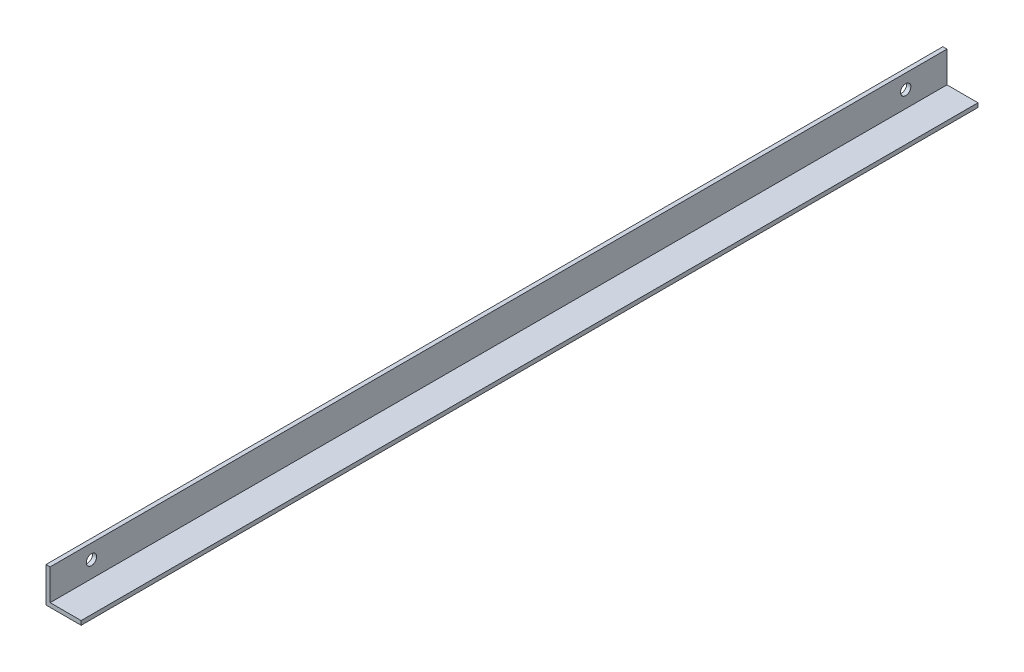
ISO-10303-21;
HEADER;
FILE_DESCRIPTION(('STEP AP214'),'2;1');
FILE_NAME('part.step','',(''),(''),'','','');
FILE_SCHEMA(('AUTOMOTIVE_DESIGN { 1 0 10303 214 1 1 1 1 }'));
ENDSEC;
DATA;
#1=APPLICATION_CONTEXT('core data for automotive mechanical design processes');
#2=APPLICATION_PROTOCOL_DEFINITION('international standard','automotive_design',2000,#1);
#3=PRODUCT_CONTEXT('',#1,'mechanical');
#4=PRODUCT('Part','Part','',(#3));
#5=PRODUCT_RELATED_PRODUCT_CATEGORY('part','',(#4));
#6=PRODUCT_DEFINITION_FORMATION('','',#4);
#7=PRODUCT_DEFINITION_CONTEXT('part definition',#1,'design');
#8=PRODUCT_DEFINITION('design','',#6,#7);
#9=PRODUCT_DEFINITION_SHAPE('','',#8);
#10=(LENGTH_UNIT() NAMED_UNIT(*) SI_UNIT(.MILLI.,.METRE.));
#11=(NAMED_UNIT(*) PLANE_ANGLE_UNIT() SI_UNIT($,.RADIAN.));
#12=(NAMED_UNIT(*) SI_UNIT($,.STERADIAN.) SOLID_ANGLE_UNIT());
#13=UNCERTAINTY_MEASURE_WITH_UNIT(LENGTH_MEASURE(1.E-05),#10,'distance_accuracy_value','');
#14=(GEOMETRIC_REPRESENTATION_CONTEXT(3) GLOBAL_UNCERTAINTY_ASSIGNED_CONTEXT((#13)) GLOBAL_UNIT_ASSIGNED_CONTEXT((#10,
#11,#12)) REPRESENTATION_CONTEXT('',''));
#15=CARTESIAN_POINT('',(0.,0.,0.));
#16=DIRECTION('',(0.,0.,1.));
#17=DIRECTION('',(1.,0.,0.));
#18=AXIS2_PLACEMENT_3D('',#15,#16,#17);
#19=CARTESIAN_POINT('',(13.,0.,-434.));
#20=DIRECTION('',(0.,1.,0.));
#21=DIRECTION('',(-1.,0.,0.));
#22=AXIS2_PLACEMENT_3D('',#19,#20,#21);
#23=PLANE('',#22);
#24=DIRECTION('',(-1.,0.,0.));
#25=VECTOR('',#24,1.);
#26=CARTESIAN_POINT('',(13.,0.,0.));
#27=LINE('',#26,#25);
#28=CARTESIAN_POINT('',(15.,0.,0.));
#29=VERTEX_POINT('',#28);
#30=CARTESIAN_POINT('',(0.,0.,0.));
#31=VERTEX_POINT('',#30);
#32=EDGE_CURVE('E103',#29,#31,#27,.T.);
#33=ORIENTED_EDGE('',*,*,#32,.F.);
#34=DIRECTION('',(0.,0.,-1.));
#35=VECTOR('',#34,1.);
#36=CARTESIAN_POINT('',(15.,0.,2.82842712474618));
#37=LINE('',#36,#35);
#38=CARTESIAN_POINT('',(15.,0.,-434.));
#39=VERTEX_POINT('',#38);
#40=EDGE_CURVE('E101',#29,#39,#37,.T.);
#41=ORIENTED_EDGE('',*,*,#40,.T.);
#42=DIRECTION('',(-1.,0.,0.));
#43=VECTOR('',#42,1.);
#44=CARTESIAN_POINT('',(13.,0.,-434.));
#45=LINE('',#44,#43);
#46=CARTESIAN_POINT('',(0.,0.,-434.));
#47=VERTEX_POINT('',#46);
#48=EDGE_CURVE('E91',#39,#47,#45,.T.);
#49=ORIENTED_EDGE('',*,*,#48,.T.);
#50=DIRECTION('',(0.,0.,1.));
#51=VECTOR('',#50,1.);
#52=CARTESIAN_POINT('',(0.,0.,-434.));
#53=LINE('',#52,#51);
#54=EDGE_CURVE('E44',#47,#31,#53,.T.);
#55=ORIENTED_EDGE('',*,*,#54,.T.);
#56=EDGE_LOOP('',(#33,#41,#49,#55));
#57=FACE_BOUND('',#56,.T.);
#58=ADVANCED_FACE('F35',(#57),#23,.T.);
#59=CARTESIAN_POINT('',(-2.,-2.,-434.));
#60=DIRECTION('',(0.,-1.,0.));
#61=DIRECTION('',(1.,0.,0.));
#62=AXIS2_PLACEMENT_3D('',#59,#60,#61);
#63=PLANE('',#62);
#64=DIRECTION('',(1.,0.,0.));
#65=VECTOR('',#64,1.);
#66=CARTESIAN_POINT('',(-2.,-2.,0.));
#67=LINE('',#66,#65);
#68=CARTESIAN_POINT('',(-2.,-2.,0.));
#69=VERTEX_POINT('',#68);
#70=CARTESIAN_POINT('',(15.,-2.,0.));
#71=VERTEX_POINT('',#70);
#72=EDGE_CURVE('E98',#69,#71,#67,.T.);
#73=ORIENTED_EDGE('',*,*,#72,.F.);
#74=DIRECTION('',(0.,0.,1.));
#75=VECTOR('',#74,1.);
#76=CARTESIAN_POINT('',(-2.,-2.,-434.));
#77=LINE('',#76,#75);
#78=CARTESIAN_POINT('',(-2.,-2.,-434.));
#79=VERTEX_POINT('',#78);
#80=EDGE_CURVE('E11',#79,#69,#77,.T.);
#81=ORIENTED_EDGE('',*,*,#80,.F.);
#82=DIRECTION('',(1.,0.,0.));
#83=VECTOR('',#82,1.);
#84=CARTESIAN_POINT('',(-2.,-2.,-434.));
#85=LINE('',#84,#83);
#86=CARTESIAN_POINT('',(15.,-2.,-434.));
#87=VERTEX_POINT('',#86);
#88=EDGE_CURVE('E137',#79,#87,#85,.T.);
#89=ORIENTED_EDGE('',*,*,#88,.T.);
#90=DIRECTION('',(0.,0.,-1.));
#91=VECTOR('',#90,1.);
#92=CARTESIAN_POINT('',(15.,-2.,2.82842712474618));
#93=LINE('',#92,#91);
#94=EDGE_CURVE('E107',#71,#87,#93,.T.);
#95=ORIENTED_EDGE('',*,*,#94,.F.);
#96=EDGE_LOOP('',(#73,#81,#89,#95));
#97=FACE_BOUND('',#96,.T.);
#98=ADVANCED_FACE('F159',(#97),#63,.T.);
#99=CARTESIAN_POINT('',(-2.,13.,-434.));
#100=DIRECTION('',(-1.,0.,0.));
#101=DIRECTION('',(0.,-1.,0.));
#102=AXIS2_PLACEMENT_3D('',#99,#100,#101);
#103=PLANE('',#102);
#104=CARTESIAN_POINT('',(-2.,8.,-414.));
#105=DIRECTION('',(-1.,0.,0.));
#106=DIRECTION('',(0.,-1.,0.));
#107=AXIS2_PLACEMENT_3D('',#104,#105,#106);
#108=CIRCLE('',#107,2.49999999999997);
#109=CARTESIAN_POINT('',(-2.,5.50000000000003,-414.));
#110=VERTEX_POINT('',#109);
#111=EDGE_CURVE('E119',#110,#110,#108,.F.);
#112=ORIENTED_EDGE('',*,*,#111,.T.);
#113=EDGE_LOOP('',(#112));
#114=FACE_BOUND('',#113,.T.);
#115=CARTESIAN_POINT('',(-2.,8.,-20.));
#116=DIRECTION('',(-1.,0.,0.));
#117=DIRECTION('',(0.,-1.,0.));
#118=AXIS2_PLACEMENT_3D('',#115,#116,#117);
#119=CIRCLE('',#118,2.5);
#120=CARTESIAN_POINT('',(-2.,5.5,-20.));
#121=VERTEX_POINT('',#120);
#122=EDGE_CURVE('E129',#121,#121,#119,.T.);
#123=ORIENTED_EDGE('',*,*,#122,.F.);
#124=EDGE_LOOP('',(#123));
#125=FACE_BOUND('',#124,.T.);
#126=DIRECTION('',(0.,-1.,0.));
#127=VECTOR('',#126,1.);
#128=CARTESIAN_POINT('',(-2.,13.,0.));
#129=LINE('',#128,#127);
#130=CARTESIAN_POINT('',(-2.,15.,0.));
#131=VERTEX_POINT('',#130);
#132=EDGE_CURVE('E69',#131,#69,#129,.T.);
#133=ORIENTED_EDGE('',*,*,#132,.F.);
#134=DIRECTION('',(0.,0.,-1.));
#135=VECTOR('',#134,1.);
#136=CARTESIAN_POINT('',(-2.,15.,2.82842712474618));
#137=LINE('',#136,#135);
#138=CARTESIAN_POINT('',(-2.,15.,-434.));
#139=VERTEX_POINT('',#138);
#140=EDGE_CURVE('E123',#131,#139,#137,.T.);
#141=ORIENTED_EDGE('',*,*,#140,.T.);
#142=DIRECTION('',(0.,-1.,0.));
#143=VECTOR('',#142,1.);
#144=CARTESIAN_POINT('',(-2.,13.,-434.));
#145=LINE('',#144,#143);
#146=EDGE_CURVE('E134',#139,#79,#145,.T.);
#147=ORIENTED_EDGE('',*,*,#146,.T.);
#148=ORIENTED_EDGE('',*,*,#80,.T.);
#149=EDGE_LOOP('',(#133,#141,#147,#148));
#150=FACE_BOUND('',#149,.T.);
#151=ADVANCED_FACE('F153',(#114,#125,#150),#103,.T.);
#152=CARTESIAN_POINT('',(0.,0.,-434.));
#153=DIRECTION('',(1.,0.,0.));
#154=DIRECTION('',(0.,1.,0.));
#155=AXIS2_PLACEMENT_3D('',#152,#153,#154);
#156=PLANE('',#155);
#157=CARTESIAN_POINT('',(0.,8.,-414.));
#158=DIRECTION('',(1.,0.,0.));
#159=DIRECTION('',(0.,1.,0.));
#160=AXIS2_PLACEMENT_3D('',#157,#158,#159);
#161=CIRCLE('',#160,2.49999999999997);
#162=CARTESIAN_POINT('',(0.,10.5,-414.));
#163=VERTEX_POINT('',#162);
#164=EDGE_CURVE('E38',#163,#163,#161,.F.);
#165=ORIENTED_EDGE('',*,*,#164,.T.);
#166=EDGE_LOOP('',(#165));
#167=FACE_BOUND('',#166,.T.);
#168=CARTESIAN_POINT('',(0.,8.,-20.));
#169=DIRECTION('',(1.,0.,0.));
#170=DIRECTION('',(0.,1.,0.));
#171=AXIS2_PLACEMENT_3D('',#168,#169,#170);
#172=CIRCLE('',#171,2.5);
#173=CARTESIAN_POINT('',(0.,10.5,-20.));
#174=VERTEX_POINT('',#173);
#175=EDGE_CURVE('E131',#174,#174,#172,.T.);
#176=ORIENTED_EDGE('',*,*,#175,.F.);
#177=EDGE_LOOP('',(#176));
#178=FACE_BOUND('',#177,.T.);
#179=DIRECTION('',(0.,1.,0.));
#180=VECTOR('',#179,1.);
#181=CARTESIAN_POINT('',(0.,0.,0.));
#182=LINE('',#181,#180);
#183=CARTESIAN_POINT('',(0.,15.,0.));
#184=VERTEX_POINT('',#183);
#185=EDGE_CURVE('E140',#31,#184,#182,.T.);
#186=ORIENTED_EDGE('',*,*,#185,.F.);
#187=ORIENTED_EDGE('',*,*,#54,.F.);
#188=DIRECTION('',(0.,1.,0.));
#189=VECTOR('',#188,1.);
#190=CARTESIAN_POINT('',(0.,0.,-434.));
#191=LINE('',#190,#189);
#192=CARTESIAN_POINT('',(0.,15.,-434.));
#193=VERTEX_POINT('',#192);
#194=EDGE_CURVE('E97',#47,#193,#191,.T.);
#195=ORIENTED_EDGE('',*,*,#194,.T.);
#196=DIRECTION('',(0.,0.,-1.));
#197=VECTOR('',#196,1.);
#198=CARTESIAN_POINT('',(0.,15.,2.82842712474618));
#199=LINE('',#198,#197);
#200=EDGE_CURVE('E120',#184,#193,#199,.T.);
#201=ORIENTED_EDGE('',*,*,#200,.F.);
#202=EDGE_LOOP('',(#186,#187,#195,#201));
#203=FACE_BOUND('',#202,.T.);
#204=ADVANCED_FACE('F150',(#167,#178,#203),#156,.T.);
#205=CARTESIAN_POINT('',(0.,0.,-434.));
#206=DIRECTION('',(0.,0.,-1.));
#207=DIRECTION('',(-1.,0.,0.));
#208=AXIS2_PLACEMENT_3D('',#205,#206,#207);
#209=PLANE('',#208);
#210=ORIENTED_EDGE('',*,*,#48,.F.);
#211=DIRECTION('',(0.,-1.,0.));
#212=VECTOR('',#211,1.);
#213=CARTESIAN_POINT('',(15.,-2.,-434.));
#214=LINE('',#213,#212);
#215=EDGE_CURVE('E95',#39,#87,#214,.T.);
#216=ORIENTED_EDGE('',*,*,#215,.T.);
#217=ORIENTED_EDGE('',*,*,#88,.F.);
#218=ORIENTED_EDGE('',*,*,#146,.F.);
#219=DIRECTION('',(1.,0.,0.));
#220=VECTOR('',#219,1.);
#221=CARTESIAN_POINT('',(0.,15.,-434.));
#222=LINE('',#221,#220);
#223=EDGE_CURVE('E121',#139,#193,#222,.T.);
#224=ORIENTED_EDGE('',*,*,#223,.T.);
#225=ORIENTED_EDGE('',*,*,#194,.F.);
#226=EDGE_LOOP('',(#210,#216,#217,#218,#224,#225));
#227=FACE_BOUND('',#226,.T.);
#228=ADVANCED_FACE('F93',(#227),#209,.T.);
#229=CARTESIAN_POINT('',(0.,0.,0.));
#230=DIRECTION('',(0.,0.,-1.));
#231=DIRECTION('',(-1.,0.,0.));
#232=AXIS2_PLACEMENT_3D('',#229,#230,#231);
#233=PLANE('',#232);
#234=ORIENTED_EDGE('',*,*,#32,.T.);
#235=ORIENTED_EDGE('',*,*,#185,.T.);
#236=DIRECTION('',(-1.,0.,0.));
#237=VECTOR('',#236,1.);
#238=CARTESIAN_POINT('',(0.,15.,0.));
#239=LINE('',#238,#237);
#240=EDGE_CURVE('E117',#184,#131,#239,.T.);
#241=ORIENTED_EDGE('',*,*,#240,.T.);
#242=ORIENTED_EDGE('',*,*,#132,.T.);
#243=ORIENTED_EDGE('',*,*,#72,.T.);
#244=DIRECTION('',(0.,1.,0.));
#245=VECTOR('',#244,1.);
#246=CARTESIAN_POINT('',(15.,-2.,0.));
#247=LINE('',#246,#245);
#248=EDGE_CURVE('E115',#71,#29,#247,.T.);
#249=ORIENTED_EDGE('',*,*,#248,.T.);
#250=EDGE_LOOP('',(#234,#235,#241,#242,#243,#249));
#251=FACE_BOUND('',#250,.T.);
#252=ADVANCED_FACE('F158',(#251),#233,.F.);
#253=CARTESIAN_POINT('',(13.,8.,-20.));
#254=DIRECTION('',(-1.,0.,0.));
#255=DIRECTION('',(0.,-1.,0.));
#256=AXIS2_PLACEMENT_3D('',#253,#254,#255);
#257=CYLINDRICAL_SURFACE('',#256,2.5);
#258=ORIENTED_EDGE('',*,*,#175,.T.);
#259=EDGE_LOOP('',(#258));
#260=FACE_BOUND('',#259,.T.);
#261=ORIENTED_EDGE('',*,*,#122,.T.);
#262=EDGE_LOOP('',(#261));
#263=FACE_BOUND('',#262,.T.);
#264=ADVANCED_FACE('F147',(#260,#263),#257,.F.);
#265=CARTESIAN_POINT('',(13.,8.,-414.));
#266=DIRECTION('',(-1.,0.,0.));
#267=DIRECTION('',(0.,-1.,0.));
#268=AXIS2_PLACEMENT_3D('',#265,#266,#267);
#269=CYLINDRICAL_SURFACE('',#268,2.49999999999997);
#270=ORIENTED_EDGE('',*,*,#164,.F.);
#271=EDGE_LOOP('',(#270));
#272=FACE_BOUND('',#271,.T.);
#273=ORIENTED_EDGE('',*,*,#111,.F.);
#274=EDGE_LOOP('',(#273));
#275=FACE_BOUND('',#274,.T.);
#276=ADVANCED_FACE('F165',(#272,#275),#269,.F.);
#277=CARTESIAN_POINT('',(0.,15.,2.82842712474618));
#278=DIRECTION('',(0.,1.,0.));
#279=DIRECTION('',(0.,0.,1.));
#280=AXIS2_PLACEMENT_3D('',#277,#278,#279);
#281=PLANE('',#280);
#282=ORIENTED_EDGE('',*,*,#240,.F.);
#283=ORIENTED_EDGE('',*,*,#200,.T.);
#284=ORIENTED_EDGE('',*,*,#223,.F.);
#285=ORIENTED_EDGE('',*,*,#140,.F.);
#286=EDGE_LOOP('',(#282,#283,#284,#285));
#287=FACE_BOUND('',#286,.T.);
#288=ADVANCED_FACE('F163',(#287),#281,.T.);
#289=CARTESIAN_POINT('',(15.,-2.,2.82842712474618));
#290=DIRECTION('',(1.,0.,0.));
#291=DIRECTION('',(0.,0.,-1.));
#292=AXIS2_PLACEMENT_3D('',#289,#290,#291);
#293=PLANE('',#292);
#294=ORIENTED_EDGE('',*,*,#248,.F.);
#295=ORIENTED_EDGE('',*,*,#94,.T.);
#296=ORIENTED_EDGE('',*,*,#215,.F.);
#297=ORIENTED_EDGE('',*,*,#40,.F.);
#298=EDGE_LOOP('',(#294,#295,#296,#297));
#299=FACE_BOUND('',#298,.T.);
#300=ADVANCED_FACE('F110',(#299),#293,.T.);
#301=CLOSED_SHELL('',(#58,#98,#151,#204,#228,#252,#264,#276,#288,#300));
#302=MANIFOLD_SOLID_BREP('B2',#301);
#303=ADVANCED_BREP_SHAPE_REPRESENTATION('',(#18,#302),#14);
#304=SHAPE_DEFINITION_REPRESENTATION(#9,#303);
ENDSEC;
END-ISO-10303-21;
